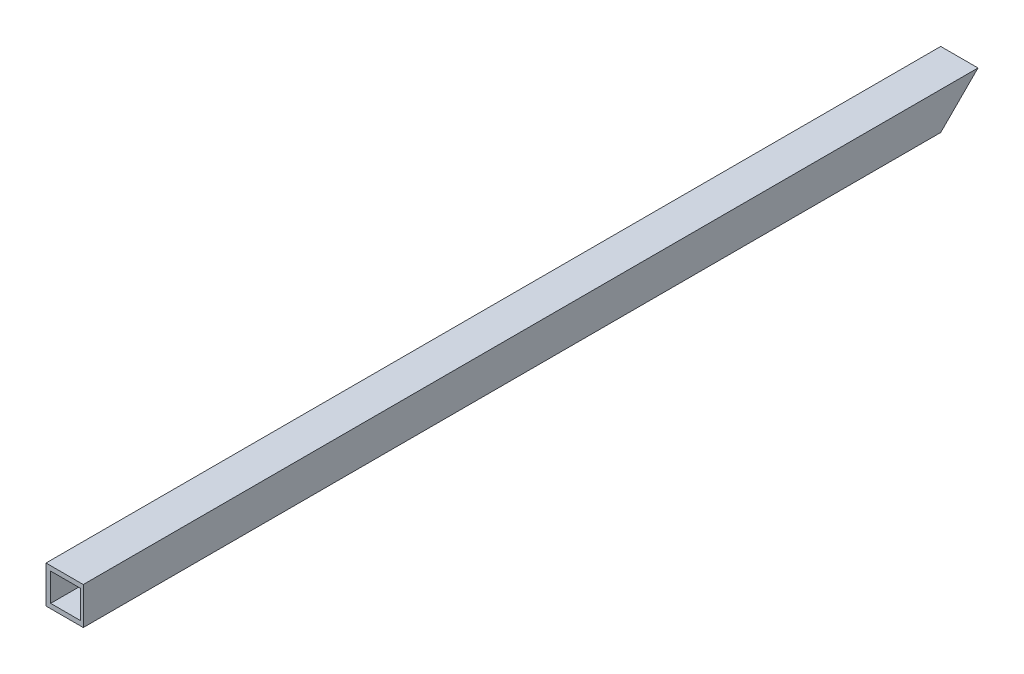
ISO-10303-21;
HEADER;
FILE_DESCRIPTION(('STEP AP214'),'2;1');
FILE_NAME('part.step','',(''),(''),'','','');
FILE_SCHEMA(('AUTOMOTIVE_DESIGN { 1 0 10303 214 1 1 1 1 }'));
ENDSEC;
DATA;
#1=APPLICATION_CONTEXT('core data for automotive mechanical design processes');
#2=APPLICATION_PROTOCOL_DEFINITION('international standard','automotive_design',2000,#1);
#3=PRODUCT_CONTEXT('',#1,'mechanical');
#4=PRODUCT('Part','Part','',(#3));
#5=PRODUCT_RELATED_PRODUCT_CATEGORY('part','',(#4));
#6=PRODUCT_DEFINITION_FORMATION('','',#4);
#7=PRODUCT_DEFINITION_CONTEXT('part definition',#1,'design');
#8=PRODUCT_DEFINITION('design','',#6,#7);
#9=PRODUCT_DEFINITION_SHAPE('','',#8);
#10=(LENGTH_UNIT() NAMED_UNIT(*) SI_UNIT(.MILLI.,.METRE.));
#11=(NAMED_UNIT(*) PLANE_ANGLE_UNIT() SI_UNIT($,.RADIAN.));
#12=(NAMED_UNIT(*) SI_UNIT($,.STERADIAN.) SOLID_ANGLE_UNIT());
#13=UNCERTAINTY_MEASURE_WITH_UNIT(LENGTH_MEASURE(1.E-05),#10,'distance_accuracy_value','');
#14=(GEOMETRIC_REPRESENTATION_CONTEXT(3) GLOBAL_UNCERTAINTY_ASSIGNED_CONTEXT((#13)) GLOBAL_UNIT_ASSIGNED_CONTEXT((#10,
#11,#12)) REPRESENTATION_CONTEXT('',''));
#15=CARTESIAN_POINT('',(0.,0.,0.));
#16=DIRECTION('',(0.,0.,1.));
#17=DIRECTION('',(1.,0.,0.));
#18=AXIS2_PLACEMENT_3D('',#15,#16,#17);
#19=CARTESIAN_POINT('',(0.,0.,609.6));
#20=DIRECTION('',(-1.,0.,0.));
#21=DIRECTION('',(0.,-1.,0.));
#22=AXIS2_PLACEMENT_3D('',#19,#20,#21);
#23=PLANE('',#22);
#24=DIRECTION('',(0.,-0.707106781186551,0.707106781186544));
#25=VECTOR('',#24,1.);
#26=CARTESIAN_POINT('',(0.,25.3999999999999,0.));
#27=LINE('',#26,#25);
#28=CARTESIAN_POINT('',(0.,25.4,0.));
#29=VERTEX_POINT('',#28);
#30=CARTESIAN_POINT('',(0.,0.,25.3999999999996));
#31=VERTEX_POINT('',#30);
#32=EDGE_CURVE('E106',#29,#31,#27,.T.);
#33=ORIENTED_EDGE('',*,*,#32,.T.);
#34=DIRECTION('',(0.,0.,-1.));
#35=VECTOR('',#34,1.);
#36=CARTESIAN_POINT('',(0.,0.,609.6));
#37=LINE('',#36,#35);
#38=CARTESIAN_POINT('',(0.,0.,609.6));
#39=VERTEX_POINT('',#38);
#40=EDGE_CURVE('E47',#39,#31,#37,.T.);
#41=ORIENTED_EDGE('',*,*,#40,.F.);
#42=DIRECTION('',(0.,1.,0.));
#43=VECTOR('',#42,1.);
#44=CARTESIAN_POINT('',(0.,0.,609.6));
#45=LINE('',#44,#43);
#46=CARTESIAN_POINT('',(0.,25.4,609.6));
#47=VERTEX_POINT('',#46);
#48=EDGE_CURVE('E149',#39,#47,#45,.T.);
#49=ORIENTED_EDGE('',*,*,#48,.T.);
#50=DIRECTION('',(0.,0.,-1.));
#51=VECTOR('',#50,1.);
#52=CARTESIAN_POINT('',(0.,25.4,609.6));
#53=LINE('',#52,#51);
#54=EDGE_CURVE('E119',#47,#29,#53,.T.);
#55=ORIENTED_EDGE('',*,*,#54,.T.);
#56=EDGE_LOOP('',(#33,#41,#49,#55));
#57=FACE_BOUND('',#56,.T.);
#58=ADVANCED_FACE('F39',(#57),#23,.T.);
#59=CARTESIAN_POINT('',(0.,0.,609.6));
#60=DIRECTION('',(0.,1.,0.));
#61=DIRECTION('',(0.,0.,1.));
#62=AXIS2_PLACEMENT_3D('',#59,#60,#61);
#63=PLANE('',#62);
#64=ORIENTED_EDGE('',*,*,#40,.T.);
#65=DIRECTION('',(1.,0.,0.));
#66=VECTOR('',#65,1.);
#67=CARTESIAN_POINT('',(0.,0.,25.3999999999996));
#68=LINE('',#67,#66);
#69=CARTESIAN_POINT('',(25.4,0.,25.3999999999996));
#70=VERTEX_POINT('',#69);
#71=EDGE_CURVE('E103',#31,#70,#68,.T.);
#72=ORIENTED_EDGE('',*,*,#71,.T.);
#73=DIRECTION('',(0.,0.,-1.));
#74=VECTOR('',#73,1.);
#75=CARTESIAN_POINT('',(25.4,0.,609.6));
#76=LINE('',#75,#74);
#77=CARTESIAN_POINT('',(25.4,0.,609.6));
#78=VERTEX_POINT('',#77);
#79=EDGE_CURVE('E127',#78,#70,#76,.T.);
#80=ORIENTED_EDGE('',*,*,#79,.F.);
#81=DIRECTION('',(1.,0.,0.));
#82=VECTOR('',#81,1.);
#83=CARTESIAN_POINT('',(0.,0.,609.6));
#84=LINE('',#83,#82);
#85=EDGE_CURVE('E124',#39,#78,#84,.T.);
#86=ORIENTED_EDGE('',*,*,#85,.F.);
#87=EDGE_LOOP('',(#64,#72,#80,#86));
#88=FACE_BOUND('',#87,.T.);
#89=ADVANCED_FACE('F123',(#88),#63,.F.);
#90=CARTESIAN_POINT('',(25.4,0.,609.6));
#91=DIRECTION('',(-1.,0.,0.));
#92=DIRECTION('',(0.,-1.,0.));
#93=AXIS2_PLACEMENT_3D('',#90,#91,#92);
#94=PLANE('',#93);
#95=ORIENTED_EDGE('',*,*,#79,.T.);
#96=DIRECTION('',(0.,-0.707106781186551,0.707106781186544));
#97=VECTOR('',#96,1.);
#98=CARTESIAN_POINT('',(25.4,25.3999999999999,0.));
#99=LINE('',#98,#97);
#100=CARTESIAN_POINT('',(25.4,25.3999999999999,0.));
#101=VERTEX_POINT('',#100);
#102=EDGE_CURVE('E109',#101,#70,#99,.T.);
#103=ORIENTED_EDGE('',*,*,#102,.F.);
#104=DIRECTION('',(0.,0.,-1.));
#105=VECTOR('',#104,1.);
#106=CARTESIAN_POINT('',(25.4,25.4,609.6));
#107=LINE('',#106,#105);
#108=CARTESIAN_POINT('',(25.4,25.4,609.6));
#109=VERTEX_POINT('',#108);
#110=EDGE_CURVE('E130',#109,#101,#107,.T.);
#111=ORIENTED_EDGE('',*,*,#110,.F.);
#112=DIRECTION('',(0.,1.,0.));
#113=VECTOR('',#112,1.);
#114=CARTESIAN_POINT('',(25.4,0.,609.6));
#115=LINE('',#114,#113);
#116=EDGE_CURVE('E140',#78,#109,#115,.T.);
#117=ORIENTED_EDGE('',*,*,#116,.F.);
#118=EDGE_LOOP('',(#95,#103,#111,#117));
#119=FACE_BOUND('',#118,.T.);
#120=ADVANCED_FACE('F196',(#119),#94,.F.);
#121=CARTESIAN_POINT('',(0.,25.4,609.6));
#122=DIRECTION('',(0.,1.,0.));
#123=DIRECTION('',(0.,0.,1.));
#124=AXIS2_PLACEMENT_3D('',#121,#122,#123);
#125=PLANE('',#124);
#126=DIRECTION('',(1.,0.,0.));
#127=VECTOR('',#126,1.);
#128=CARTESIAN_POINT('',(0.,25.4,0.));
#129=LINE('',#128,#127);
#130=EDGE_CURVE('E133',#29,#101,#129,.T.);
#131=ORIENTED_EDGE('',*,*,#130,.F.);
#132=ORIENTED_EDGE('',*,*,#54,.F.);
#133=DIRECTION('',(1.,0.,0.));
#134=VECTOR('',#133,1.);
#135=CARTESIAN_POINT('',(0.,25.4,609.6));
#136=LINE('',#135,#134);
#137=EDGE_CURVE('E143',#47,#109,#136,.T.);
#138=ORIENTED_EDGE('',*,*,#137,.T.);
#139=ORIENTED_EDGE('',*,*,#110,.T.);
#140=EDGE_LOOP('',(#131,#132,#138,#139));
#141=FACE_BOUND('',#140,.T.);
#142=ADVANCED_FACE('F198',(#141),#125,.T.);
#143=CARTESIAN_POINT('',(0.,0.,609.6));
#144=DIRECTION('',(0.,0.,-1.));
#145=DIRECTION('',(-1.,0.,0.));
#146=AXIS2_PLACEMENT_3D('',#143,#144,#145);
#147=PLANE('',#146);
#148=DIRECTION('',(1.,0.,0.));
#149=VECTOR('',#148,1.);
#150=CARTESIAN_POINT('',(23.4777661909682,22.225,609.6));
#151=LINE('',#150,#149);
#152=CARTESIAN_POINT('',(3.175,22.225,609.6));
#153=VERTEX_POINT('',#152);
#154=CARTESIAN_POINT('',(23.4777661909682,22.225,609.6));
#155=VERTEX_POINT('',#154);
#156=EDGE_CURVE('E157',#153,#155,#151,.T.);
#157=ORIENTED_EDGE('',*,*,#156,.T.);
#158=DIRECTION('',(0.,-1.,0.));
#159=VECTOR('',#158,1.);
#160=CARTESIAN_POINT('',(23.4777661909682,22.225,609.6));
#161=LINE('',#160,#159);
#162=CARTESIAN_POINT('',(23.4777661909682,3.175,609.6));
#163=VERTEX_POINT('',#162);
#164=EDGE_CURVE('E177',#155,#163,#161,.T.);
#165=ORIENTED_EDGE('',*,*,#164,.T.);
#166=DIRECTION('',(-1.,0.,0.));
#167=VECTOR('',#166,1.);
#168=CARTESIAN_POINT('',(23.4777661909682,3.175,609.6));
#169=LINE('',#168,#167);
#170=CARTESIAN_POINT('',(3.175,3.175,609.6));
#171=VERTEX_POINT('',#170);
#172=EDGE_CURVE('E173',#163,#171,#169,.T.);
#173=ORIENTED_EDGE('',*,*,#172,.T.);
#174=DIRECTION('',(0.,1.,0.));
#175=VECTOR('',#174,1.);
#176=CARTESIAN_POINT('',(3.175,22.225,609.6));
#177=LINE('',#176,#175);
#178=EDGE_CURVE('E61',#171,#153,#177,.T.);
#179=ORIENTED_EDGE('',*,*,#178,.T.);
#180=EDGE_LOOP('',(#157,#165,#173,#179));
#181=FACE_BOUND('',#180,.T.);
#182=ORIENTED_EDGE('',*,*,#48,.F.);
#183=ORIENTED_EDGE('',*,*,#85,.T.);
#184=ORIENTED_EDGE('',*,*,#116,.T.);
#185=ORIENTED_EDGE('',*,*,#137,.F.);
#186=EDGE_LOOP('',(#182,#183,#184,#185));
#187=FACE_BOUND('',#186,.T.);
#188=ADVANCED_FACE('F200',(#181,#187),#147,.F.);
#189=CARTESIAN_POINT('',(23.4777661909682,22.225,609.6));
#190=DIRECTION('',(1.,0.,0.));
#191=DIRECTION('',(0.,1.,0.));
#192=AXIS2_PLACEMENT_3D('',#189,#190,#191);
#193=PLANE('',#192);
#194=DIRECTION('',(0.,0.,-1.));
#195=VECTOR('',#194,1.);
#196=CARTESIAN_POINT('',(23.4777661909682,22.225,609.6));
#197=LINE('',#196,#195);
#198=CARTESIAN_POINT('',(23.4777661909682,22.225,3.17499999999993));
#199=VERTEX_POINT('',#198);
#200=EDGE_CURVE('E164',#155,#199,#197,.T.);
#201=ORIENTED_EDGE('',*,*,#200,.T.);
#202=DIRECTION('',(0.,-0.707106781186551,0.707106781186544));
#203=VECTOR('',#202,1.);
#204=CARTESIAN_POINT('',(23.4777661909681,-280.9875,306.387499999997));
#205=LINE('',#204,#203);
#206=CARTESIAN_POINT('',(23.4777661909682,3.175,22.2249999999997));
#207=VERTEX_POINT('',#206);
#208=EDGE_CURVE('E181',#199,#207,#205,.T.);
#209=ORIENTED_EDGE('',*,*,#208,.T.);
#210=DIRECTION('',(0.,0.,-1.));
#211=VECTOR('',#210,1.);
#212=CARTESIAN_POINT('',(23.4777661909682,3.175,609.6));
#213=LINE('',#212,#211);
#214=EDGE_CURVE('E152',#163,#207,#213,.T.);
#215=ORIENTED_EDGE('',*,*,#214,.F.);
#216=ORIENTED_EDGE('',*,*,#164,.F.);
#217=EDGE_LOOP('',(#201,#209,#215,#216));
#218=FACE_BOUND('',#217,.T.);
#219=ADVANCED_FACE('F202',(#218),#193,.F.);
#220=CARTESIAN_POINT('',(23.4777661909682,22.225,609.6));
#221=DIRECTION('',(0.,1.,0.));
#222=DIRECTION('',(0.,0.,1.));
#223=AXIS2_PLACEMENT_3D('',#220,#221,#222);
#224=PLANE('',#223);
#225=DIRECTION('',(0.,0.,-1.));
#226=VECTOR('',#225,1.);
#227=CARTESIAN_POINT('',(3.175,22.225,609.6));
#228=LINE('',#227,#226);
#229=CARTESIAN_POINT('',(3.175,22.225,3.17499999999982));
#230=VERTEX_POINT('',#229);
#231=EDGE_CURVE('E160',#153,#230,#228,.T.);
#232=ORIENTED_EDGE('',*,*,#231,.T.);
#233=DIRECTION('',(1.,0.,0.));
#234=VECTOR('',#233,1.);
#235=CARTESIAN_POINT('',(23.4777661909684,22.225,3.17499999999993));
#236=LINE('',#235,#234);
#237=EDGE_CURVE('E185',#230,#199,#236,.T.);
#238=ORIENTED_EDGE('',*,*,#237,.T.);
#239=ORIENTED_EDGE('',*,*,#200,.F.);
#240=ORIENTED_EDGE('',*,*,#156,.F.);
#241=EDGE_LOOP('',(#232,#238,#239,#240));
#242=FACE_BOUND('',#241,.T.);
#243=ADVANCED_FACE('F209',(#242),#224,.F.);
#244=CARTESIAN_POINT('',(3.175,22.225,609.6));
#245=DIRECTION('',(-1.,0.,0.));
#246=DIRECTION('',(0.,-1.,0.));
#247=AXIS2_PLACEMENT_3D('',#244,#245,#246);
#248=PLANE('',#247);
#249=DIRECTION('',(0.,0.,-1.));
#250=VECTOR('',#249,1.);
#251=CARTESIAN_POINT('',(3.175,3.175,609.6));
#252=LINE('',#251,#250);
#253=CARTESIAN_POINT('',(3.175,3.175,22.2249999999999));
#254=VERTEX_POINT('',#253);
#255=EDGE_CURVE('E156',#171,#254,#252,.T.);
#256=ORIENTED_EDGE('',*,*,#255,.T.);
#257=DIRECTION('',(0.,0.707106781186551,-0.707106781186544));
#258=VECTOR('',#257,1.);
#259=CARTESIAN_POINT('',(3.17499999999995,-280.9875,306.387499999997));
#260=LINE('',#259,#258);
#261=EDGE_CURVE('E54',#254,#230,#260,.T.);
#262=ORIENTED_EDGE('',*,*,#261,.T.);
#263=ORIENTED_EDGE('',*,*,#231,.F.);
#264=ORIENTED_EDGE('',*,*,#178,.F.);
#265=EDGE_LOOP('',(#256,#262,#263,#264));
#266=FACE_BOUND('',#265,.T.);
#267=ADVANCED_FACE('F243',(#266),#248,.F.);
#268=CARTESIAN_POINT('',(23.4777661909682,3.175,609.6));
#269=DIRECTION('',(0.,-1.,0.));
#270=DIRECTION('',(0.,0.,-1.));
#271=AXIS2_PLACEMENT_3D('',#268,#269,#270);
#272=PLANE('',#271);
#273=ORIENTED_EDGE('',*,*,#214,.T.);
#274=DIRECTION('',(-1.,0.,0.));
#275=VECTOR('',#274,1.);
#276=CARTESIAN_POINT('',(23.4777661909684,3.175,22.2249999999997));
#277=LINE('',#276,#275);
#278=EDGE_CURVE('E11',#207,#254,#277,.T.);
#279=ORIENTED_EDGE('',*,*,#278,.T.);
#280=ORIENTED_EDGE('',*,*,#255,.F.);
#281=ORIENTED_EDGE('',*,*,#172,.F.);
#282=EDGE_LOOP('',(#273,#279,#280,#281));
#283=FACE_BOUND('',#282,.T.);
#284=ADVANCED_FACE('F253',(#283),#272,.F.);
#285=CARTESIAN_POINT('',(0.,25.3999999999999,0.));
#286=DIRECTION('',(0.,0.707106781186544,0.707106781186552));
#287=DIRECTION('',(0.,-0.707106781186551,0.707106781186544));
#288=AXIS2_PLACEMENT_3D('',#285,#286,#287);
#289=PLANE('',#288);
#290=ORIENTED_EDGE('',*,*,#102,.T.);
#291=ORIENTED_EDGE('',*,*,#71,.F.);
#292=ORIENTED_EDGE('',*,*,#32,.F.);
#293=ORIENTED_EDGE('',*,*,#130,.T.);
#294=EDGE_LOOP('',(#290,#291,#292,#293));
#295=FACE_BOUND('',#294,.T.);
#296=ORIENTED_EDGE('',*,*,#237,.F.);
#297=ORIENTED_EDGE('',*,*,#261,.F.);
#298=ORIENTED_EDGE('',*,*,#278,.F.);
#299=ORIENTED_EDGE('',*,*,#208,.F.);
#300=EDGE_LOOP('',(#296,#297,#298,#299));
#301=FACE_BOUND('',#300,.T.);
#302=ADVANCED_FACE('F105',(#295,#301),#289,.F.);
#303=CLOSED_SHELL('',(#58,#89,#120,#142,#188,#219,#243,#267,#284,#302));
#304=MANIFOLD_SOLID_BREP('B2',#303);
#305=ADVANCED_BREP_SHAPE_REPRESENTATION('',(#18,#304),#14);
#306=SHAPE_DEFINITION_REPRESENTATION(#9,#305);
ENDSEC;
END-ISO-10303-21;
